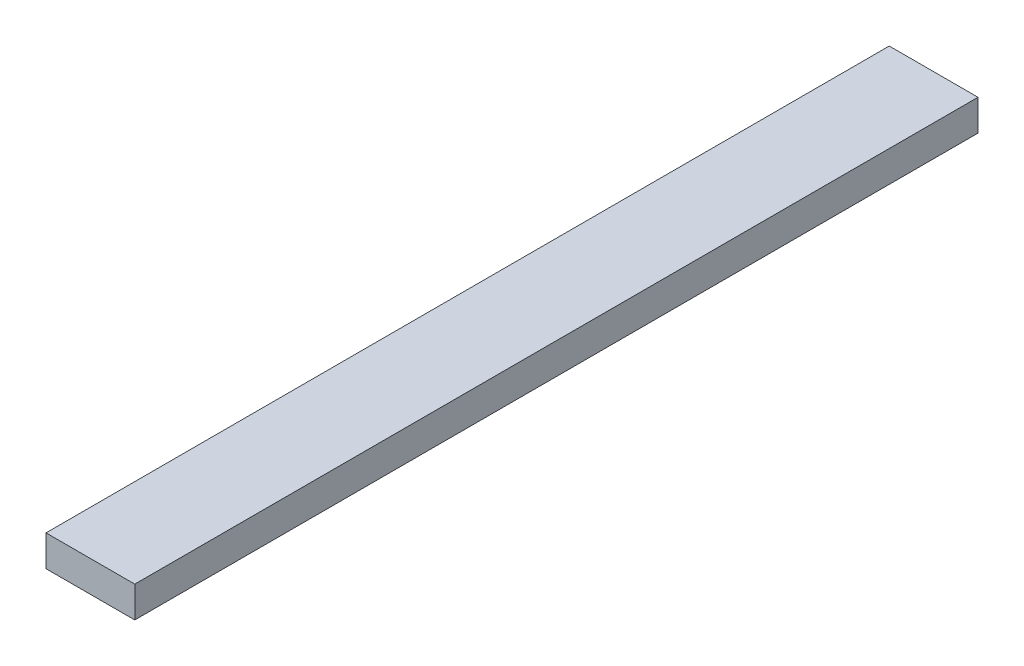
ISO-10303-21;
HEADER;
FILE_DESCRIPTION(('STEP AP214'),'2;1');
FILE_NAME('part.step','',(''),(''),'','','');
FILE_SCHEMA(('AUTOMOTIVE_DESIGN { 1 0 10303 214 1 1 1 1 }'));
ENDSEC;
DATA;
#1=APPLICATION_CONTEXT('core data for automotive mechanical design processes');
#2=APPLICATION_PROTOCOL_DEFINITION('international standard','automotive_design',2000,#1);
#3=PRODUCT_CONTEXT('',#1,'mechanical');
#4=PRODUCT('Part','Part','',(#3));
#5=PRODUCT_RELATED_PRODUCT_CATEGORY('part','',(#4));
#6=PRODUCT_DEFINITION_FORMATION('','',#4);
#7=PRODUCT_DEFINITION_CONTEXT('part definition',#1,'design');
#8=PRODUCT_DEFINITION('design','',#6,#7);
#9=PRODUCT_DEFINITION_SHAPE('','',#8);
#10=(LENGTH_UNIT() NAMED_UNIT(*) SI_UNIT(.MILLI.,.METRE.));
#11=(NAMED_UNIT(*) PLANE_ANGLE_UNIT() SI_UNIT($,.RADIAN.));
#12=(NAMED_UNIT(*) SI_UNIT($,.STERADIAN.) SOLID_ANGLE_UNIT());
#13=UNCERTAINTY_MEASURE_WITH_UNIT(LENGTH_MEASURE(1.E-05),#10,'distance_accuracy_value','');
#14=(GEOMETRIC_REPRESENTATION_CONTEXT(3) GLOBAL_UNCERTAINTY_ASSIGNED_CONTEXT((#13)) GLOBAL_UNIT_ASSIGNED_CONTEXT((#10,
#11,#12)) REPRESENTATION_CONTEXT('',''));
#15=CARTESIAN_POINT('',(0.,0.,0.));
#16=DIRECTION('',(0.,0.,1.));
#17=DIRECTION('',(1.,0.,0.));
#18=AXIS2_PLACEMENT_3D('',#15,#16,#17);
#19=CARTESIAN_POINT('',(20.,7.,0.));
#20=DIRECTION('',(-1.,0.,0.));
#21=DIRECTION('',(0.,0.,1.));
#22=AXIS2_PLACEMENT_3D('',#19,#20,#21);
#23=PLANE('',#22);
#24=DIRECTION('',(0.,0.,-1.));
#25=VECTOR('',#24,1.);
#26=CARTESIAN_POINT('',(20.,0.,0.));
#27=LINE('',#26,#25);
#28=CARTESIAN_POINT('',(20.,0.,0.));
#29=VERTEX_POINT('',#28);
#30=CARTESIAN_POINT('',(20.,0.,-190.));
#31=VERTEX_POINT('',#30);
#32=EDGE_CURVE('E98',#29,#31,#27,.T.);
#33=ORIENTED_EDGE('',*,*,#32,.T.);
#34=DIRECTION('',(0.,-1.,0.));
#35=VECTOR('',#34,1.);
#36=CARTESIAN_POINT('',(20.,7.,-190.));
#37=LINE('',#36,#35);
#38=CARTESIAN_POINT('',(20.,7.,-190.));
#39=VERTEX_POINT('',#38);
#40=EDGE_CURVE('E11',#39,#31,#37,.T.);
#41=ORIENTED_EDGE('',*,*,#40,.F.);
#42=DIRECTION('',(0.,0.,-1.));
#43=VECTOR('',#42,1.);
#44=CARTESIAN_POINT('',(20.,7.,0.));
#45=LINE('',#44,#43);
#46=CARTESIAN_POINT('',(20.,7.,0.));
#47=VERTEX_POINT('',#46);
#48=EDGE_CURVE('E75',#47,#39,#45,.T.);
#49=ORIENTED_EDGE('',*,*,#48,.F.);
#50=DIRECTION('',(0.,-1.,0.));
#51=VECTOR('',#50,1.);
#52=CARTESIAN_POINT('',(20.,7.,0.));
#53=LINE('',#52,#51);
#54=EDGE_CURVE('E94',#47,#29,#53,.T.);
#55=ORIENTED_EDGE('',*,*,#54,.T.);
#56=EDGE_LOOP('',(#33,#41,#49,#55));
#57=FACE_BOUND('',#56,.T.);
#58=ADVANCED_FACE('F36',(#57),#23,.F.);
#59=CARTESIAN_POINT('',(0.,7.,-190.));
#60=DIRECTION('',(0.,0.,-1.));
#61=DIRECTION('',(-1.,0.,0.));
#62=AXIS2_PLACEMENT_3D('',#59,#60,#61);
#63=PLANE('',#62);
#64=DIRECTION('',(1.,0.,0.));
#65=VECTOR('',#64,1.);
#66=CARTESIAN_POINT('',(0.,0.,-190.));
#67=LINE('',#66,#65);
#68=CARTESIAN_POINT('',(0.,0.,-190.));
#69=VERTEX_POINT('',#68);
#70=EDGE_CURVE('E84',#69,#31,#67,.T.);
#71=ORIENTED_EDGE('',*,*,#70,.F.);
#72=DIRECTION('',(0.,-1.,0.));
#73=VECTOR('',#72,1.);
#74=CARTESIAN_POINT('',(0.,7.,-190.));
#75=LINE('',#74,#73);
#76=CARTESIAN_POINT('',(0.,7.,-190.));
#77=VERTEX_POINT('',#76);
#78=EDGE_CURVE('E44',#77,#69,#75,.T.);
#79=ORIENTED_EDGE('',*,*,#78,.F.);
#80=DIRECTION('',(1.,0.,0.));
#81=VECTOR('',#80,1.);
#82=CARTESIAN_POINT('',(0.,7.,-190.));
#83=LINE('',#82,#81);
#84=EDGE_CURVE('E82',#77,#39,#83,.T.);
#85=ORIENTED_EDGE('',*,*,#84,.T.);
#86=ORIENTED_EDGE('',*,*,#40,.T.);
#87=EDGE_LOOP('',(#71,#79,#85,#86));
#88=FACE_BOUND('',#87,.T.);
#89=ADVANCED_FACE('F81',(#88),#63,.T.);
#90=CARTESIAN_POINT('',(0.,7.,0.));
#91=DIRECTION('',(-1.,0.,0.));
#92=DIRECTION('',(0.,0.,1.));
#93=AXIS2_PLACEMENT_3D('',#90,#91,#92);
#94=PLANE('',#93);
#95=DIRECTION('',(0.,0.,-1.));
#96=VECTOR('',#95,1.);
#97=CARTESIAN_POINT('',(0.,0.,0.));
#98=LINE('',#97,#96);
#99=CARTESIAN_POINT('',(0.,0.,0.));
#100=VERTEX_POINT('',#99);
#101=EDGE_CURVE('E102',#100,#69,#98,.T.);
#102=ORIENTED_EDGE('',*,*,#101,.F.);
#103=DIRECTION('',(0.,-1.,0.));
#104=VECTOR('',#103,1.);
#105=CARTESIAN_POINT('',(0.,7.,0.));
#106=LINE('',#105,#104);
#107=CARTESIAN_POINT('',(0.,7.,0.));
#108=VERTEX_POINT('',#107);
#109=EDGE_CURVE('E67',#108,#100,#106,.T.);
#110=ORIENTED_EDGE('',*,*,#109,.F.);
#111=DIRECTION('',(0.,0.,-1.));
#112=VECTOR('',#111,1.);
#113=CARTESIAN_POINT('',(0.,7.,0.));
#114=LINE('',#113,#112);
#115=EDGE_CURVE('E90',#108,#77,#114,.T.);
#116=ORIENTED_EDGE('',*,*,#115,.T.);
#117=ORIENTED_EDGE('',*,*,#78,.T.);
#118=EDGE_LOOP('',(#102,#110,#116,#117));
#119=FACE_BOUND('',#118,.T.);
#120=ADVANCED_FACE('F92',(#119),#94,.T.);
#121=CARTESIAN_POINT('',(0.,7.,0.));
#122=DIRECTION('',(0.,0.,-1.));
#123=DIRECTION('',(-1.,0.,0.));
#124=AXIS2_PLACEMENT_3D('',#121,#122,#123);
#125=PLANE('',#124);
#126=DIRECTION('',(1.,0.,0.));
#127=VECTOR('',#126,1.);
#128=CARTESIAN_POINT('',(0.,0.,0.));
#129=LINE('',#128,#127);
#130=EDGE_CURVE('E70',#100,#29,#129,.T.);
#131=ORIENTED_EDGE('',*,*,#130,.T.);
#132=ORIENTED_EDGE('',*,*,#54,.F.);
#133=DIRECTION('',(1.,0.,0.));
#134=VECTOR('',#133,1.);
#135=CARTESIAN_POINT('',(0.,7.,0.));
#136=LINE('',#135,#134);
#137=EDGE_CURVE('E52',#108,#47,#136,.T.);
#138=ORIENTED_EDGE('',*,*,#137,.F.);
#139=ORIENTED_EDGE('',*,*,#109,.T.);
#140=EDGE_LOOP('',(#131,#132,#138,#139));
#141=FACE_BOUND('',#140,.T.);
#142=ADVANCED_FACE('F115',(#141),#125,.F.);
#143=CARTESIAN_POINT('',(0.,7.,0.));
#144=DIRECTION('',(0.,1.,0.));
#145=DIRECTION('',(0.,0.,1.));
#146=AXIS2_PLACEMENT_3D('',#143,#144,#145);
#147=PLANE('',#146);
#148=ORIENTED_EDGE('',*,*,#48,.T.);
#149=ORIENTED_EDGE('',*,*,#84,.F.);
#150=ORIENTED_EDGE('',*,*,#115,.F.);
#151=ORIENTED_EDGE('',*,*,#137,.T.);
#152=EDGE_LOOP('',(#148,#149,#150,#151));
#153=FACE_BOUND('',#152,.T.);
#154=ADVANCED_FACE('F89',(#153),#147,.T.);
#155=CARTESIAN_POINT('',(0.,0.,0.));
#156=DIRECTION('',(0.,1.,0.));
#157=DIRECTION('',(0.,0.,1.));
#158=AXIS2_PLACEMENT_3D('',#155,#156,#157);
#159=PLANE('',#158);
#160=ORIENTED_EDGE('',*,*,#32,.F.);
#161=ORIENTED_EDGE('',*,*,#130,.F.);
#162=ORIENTED_EDGE('',*,*,#101,.T.);
#163=ORIENTED_EDGE('',*,*,#70,.T.);
#164=EDGE_LOOP('',(#160,#161,#162,#163));
#165=FACE_BOUND('',#164,.T.);
#166=ADVANCED_FACE('F109',(#165),#159,.F.);
#167=CLOSED_SHELL('',(#58,#89,#120,#142,#154,#166));
#168=MANIFOLD_SOLID_BREP('B2',#167);
#169=ADVANCED_BREP_SHAPE_REPRESENTATION('',(#18,#168),#14);
#170=SHAPE_DEFINITION_REPRESENTATION(#9,#169);
ENDSEC;
END-ISO-10303-21;
